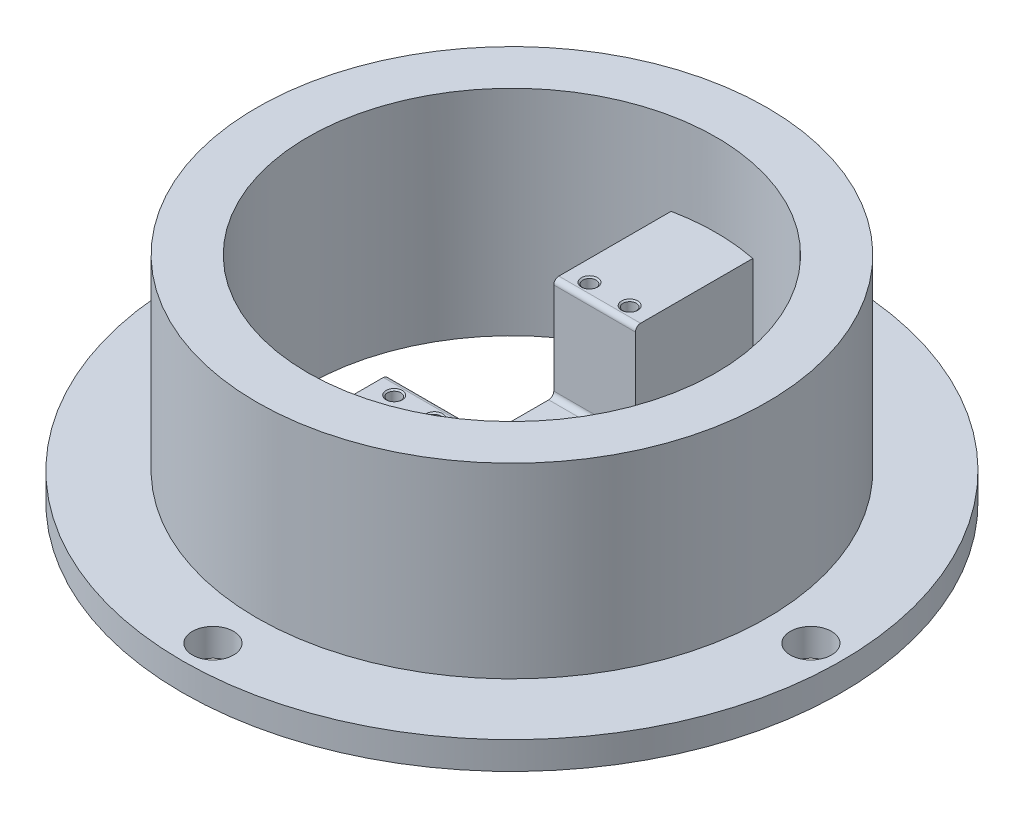
ISO-10303-21;
HEADER;
FILE_DESCRIPTION(('STEP AP214'),'2;1');
FILE_NAME('part.step','',(''),(''),'','','');
FILE_SCHEMA(('AUTOMOTIVE_DESIGN { 1 0 10303 214 1 1 1 1 }'));
ENDSEC;
DATA;
#1=APPLICATION_CONTEXT('core data for automotive mechanical design processes');
#2=APPLICATION_PROTOCOL_DEFINITION('international standard','automotive_design',2000,#1);
#3=PRODUCT_CONTEXT('',#1,'mechanical');
#4=PRODUCT('Part','Part','',(#3));
#5=PRODUCT_RELATED_PRODUCT_CATEGORY('part','',(#4));
#6=PRODUCT_DEFINITION_FORMATION('','',#4);
#7=PRODUCT_DEFINITION_CONTEXT('part definition',#1,'design');
#8=PRODUCT_DEFINITION('design','',#6,#7);
#9=PRODUCT_DEFINITION_SHAPE('','',#8);
#10=(LENGTH_UNIT() NAMED_UNIT(*) SI_UNIT(.MILLI.,.METRE.));
#11=(NAMED_UNIT(*) PLANE_ANGLE_UNIT() SI_UNIT($,.RADIAN.));
#12=(NAMED_UNIT(*) SI_UNIT($,.STERADIAN.) SOLID_ANGLE_UNIT());
#13=UNCERTAINTY_MEASURE_WITH_UNIT(LENGTH_MEASURE(1.E-05),#10,'distance_accuracy_value','');
#14=(GEOMETRIC_REPRESENTATION_CONTEXT(3) GLOBAL_UNCERTAINTY_ASSIGNED_CONTEXT((#13)) GLOBAL_UNIT_ASSIGNED_CONTEXT((#10,
#11,#12)) REPRESENTATION_CONTEXT('',''));
#15=CARTESIAN_POINT('',(0.,0.,0.));
#16=DIRECTION('',(0.,0.,1.));
#17=DIRECTION('',(1.,0.,0.));
#18=AXIS2_PLACEMENT_3D('',#15,#16,#17);
#19=CARTESIAN_POINT('',(10.16,0.,-49.7736315733542));
#20=DIRECTION('',(-1.,0.,0.));
#21=DIRECTION('',(0.,0.,1.));
#22=AXIS2_PLACEMENT_3D('',#19,#20,#21);
#23=PLANE('',#22);
#24=DIRECTION('',(0.,-1.,0.));
#25=VECTOR('',#24,1.);
#26=CARTESIAN_POINT('',(10.16,53.34,20.574));
#27=LINE('',#26,#25);
#28=CARTESIAN_POINT('',(10.16,31.496,20.574));
#29=VERTEX_POINT('',#28);
#30=CARTESIAN_POINT('',(10.16,8.636,20.574));
#31=VERTEX_POINT('',#30);
#32=EDGE_CURVE('E228',#29,#31,#27,.T.);
#33=ORIENTED_EDGE('',*,*,#32,.F.);
#34=CARTESIAN_POINT('',(10.16,31.496,21.844));
#35=DIRECTION('',(-1.,0.,0.));
#36=DIRECTION('',(0.,0.,1.));
#37=AXIS2_PLACEMENT_3D('',#34,#35,#36);
#38=CIRCLE('',#37,1.27);
#39=CARTESIAN_POINT('',(10.16,32.766,21.844));
#40=VERTEX_POINT('',#39);
#41=EDGE_CURVE('E322',#29,#40,#38,.F.);
#42=ORIENTED_EDGE('',*,*,#41,.T.);
#43=DIRECTION('',(0.,0.,-1.));
#44=VECTOR('',#43,1.);
#45=CARTESIAN_POINT('',(10.16,32.766,-11.43));
#46=LINE('',#45,#44);
#47=CARTESIAN_POINT('',(10.16,32.766,49.7736315733542));
#48=VERTEX_POINT('',#47);
#49=EDGE_CURVE('E235',#48,#40,#46,.T.);
#50=ORIENTED_EDGE('',*,*,#49,.F.);
#51=DIRECTION('',(0.,1.,0.));
#52=VECTOR('',#51,1.);
#53=CARTESIAN_POINT('',(10.16,0.,49.7736315733542));
#54=LINE('',#53,#52);
#55=CARTESIAN_POINT('',(10.16,0.,49.7736315733542));
#56=VERTEX_POINT('',#55);
#57=EDGE_CURVE('E243',#56,#48,#54,.T.);
#58=ORIENTED_EDGE('',*,*,#57,.F.);
#59=DIRECTION('',(0.,0.,1.));
#60=VECTOR('',#59,1.);
#61=CARTESIAN_POINT('',(10.16,0.,-49.7736315733542));
#62=LINE('',#61,#60);
#63=CARTESIAN_POINT('',(10.16,0.,-49.7736315733542));
#64=VERTEX_POINT('',#63);
#65=EDGE_CURVE('E262',#64,#56,#62,.T.);
#66=ORIENTED_EDGE('',*,*,#65,.F.);
#67=DIRECTION('',(0.,1.,0.));
#68=VECTOR('',#67,1.);
#69=CARTESIAN_POINT('',(10.16,0.,-49.7736315733542));
#70=LINE('',#69,#68);
#71=CARTESIAN_POINT('',(10.16,32.766,-49.7736315733542));
#72=VERTEX_POINT('',#71);
#73=EDGE_CURVE('E259',#64,#72,#70,.T.);
#74=ORIENTED_EDGE('',*,*,#73,.T.);
#75=CARTESIAN_POINT('',(10.16,32.766,-21.844));
#76=VERTEX_POINT('',#75);
#77=EDGE_CURVE('E239',#76,#72,#46,.T.);
#78=ORIENTED_EDGE('',*,*,#77,.F.);
#79=CARTESIAN_POINT('',(10.16,31.496,-21.844));
#80=DIRECTION('',(-1.,0.,0.));
#81=DIRECTION('',(0.,0.,1.));
#82=AXIS2_PLACEMENT_3D('',#79,#80,#81);
#83=CIRCLE('',#82,1.27);
#84=CARTESIAN_POINT('',(10.16,31.496,-20.574));
#85=VERTEX_POINT('',#84);
#86=EDGE_CURVE('E320',#76,#85,#83,.F.);
#87=ORIENTED_EDGE('',*,*,#86,.T.);
#88=DIRECTION('',(0.,-1.,0.));
#89=VECTOR('',#88,1.);
#90=CARTESIAN_POINT('',(10.16,53.34,-20.574));
#91=LINE('',#90,#89);
#92=CARTESIAN_POINT('',(10.16,8.636,-20.574));
#93=VERTEX_POINT('',#92);
#94=EDGE_CURVE('E225',#85,#93,#91,.T.);
#95=ORIENTED_EDGE('',*,*,#94,.T.);
#96=CARTESIAN_POINT('',(10.16,8.636,-19.304));
#97=DIRECTION('',(-1.,0.,0.));
#98=DIRECTION('',(0.,0.,1.));
#99=AXIS2_PLACEMENT_3D('',#96,#97,#98);
#100=CIRCLE('',#99,1.27);
#101=CARTESIAN_POINT('',(10.16,7.366,-19.304));
#102=VERTEX_POINT('',#101);
#103=EDGE_CURVE('E12',#93,#102,#100,.T.);
#104=ORIENTED_EDGE('',*,*,#103,.T.);
#105=DIRECTION('',(0.,0.,-1.));
#106=VECTOR('',#105,1.);
#107=CARTESIAN_POINT('',(10.16,7.366,20.574));
#108=LINE('',#107,#106);
#109=CARTESIAN_POINT('',(10.16,7.366,19.304));
#110=VERTEX_POINT('',#109);
#111=EDGE_CURVE('E220',#110,#102,#108,.T.);
#112=ORIENTED_EDGE('',*,*,#111,.F.);
#113=CARTESIAN_POINT('',(10.16,8.636,19.304));
#114=DIRECTION('',(-1.,0.,0.));
#115=DIRECTION('',(0.,0.,1.));
#116=AXIS2_PLACEMENT_3D('',#113,#114,#115);
#117=CIRCLE('',#116,1.27);
#118=EDGE_CURVE('E336',#110,#31,#117,.T.);
#119=ORIENTED_EDGE('',*,*,#118,.T.);
#120=EDGE_LOOP('',(#33,#42,#50,#58,#66,#74,#78,#87,#95,#104,#112,#119));
#121=FACE_BOUND('',#120,.T.);
#122=ADVANCED_FACE('F77',(#121),#23,.F.);
#123=CARTESIAN_POINT('',(-10.16,0.,-49.7736315733542));
#124=DIRECTION('',(1.,0.,0.));
#125=DIRECTION('',(0.,0.,-1.));
#126=AXIS2_PLACEMENT_3D('',#123,#124,#125);
#127=PLANE('',#126);
#128=DIRECTION('',(0.,0.,-1.));
#129=VECTOR('',#128,1.);
#130=CARTESIAN_POINT('',(-10.16,32.766,-11.43));
#131=LINE('',#130,#129);
#132=CARTESIAN_POINT('',(-10.16,32.766,49.7736315733542));
#133=VERTEX_POINT('',#132);
#134=CARTESIAN_POINT('',(-10.16,32.766,21.844));
#135=VERTEX_POINT('',#134);
#136=EDGE_CURVE('E240',#133,#135,#131,.T.);
#137=ORIENTED_EDGE('',*,*,#136,.T.);
#138=CARTESIAN_POINT('',(-10.16,31.496,21.844));
#139=DIRECTION('',(1.,0.,0.));
#140=DIRECTION('',(0.,0.,-1.));
#141=AXIS2_PLACEMENT_3D('',#138,#139,#140);
#142=CIRCLE('',#141,1.27);
#143=CARTESIAN_POINT('',(-10.16,31.496,20.574));
#144=VERTEX_POINT('',#143);
#145=EDGE_CURVE('E327',#135,#144,#142,.F.);
#146=ORIENTED_EDGE('',*,*,#145,.T.);
#147=DIRECTION('',(0.,-1.,0.));
#148=VECTOR('',#147,1.);
#149=CARTESIAN_POINT('',(-10.16,53.34,20.574));
#150=LINE('',#149,#148);
#151=CARTESIAN_POINT('',(-10.16,8.636,20.574));
#152=VERTEX_POINT('',#151);
#153=EDGE_CURVE('E231',#144,#152,#150,.T.);
#154=ORIENTED_EDGE('',*,*,#153,.T.);
#155=CARTESIAN_POINT('',(-10.16,8.636,19.304));
#156=DIRECTION('',(1.,0.,0.));
#157=DIRECTION('',(0.,0.,-1.));
#158=AXIS2_PLACEMENT_3D('',#155,#156,#157);
#159=CIRCLE('',#158,1.27);
#160=CARTESIAN_POINT('',(-10.16,7.366,19.304));
#161=VERTEX_POINT('',#160);
#162=EDGE_CURVE('E338',#152,#161,#159,.T.);
#163=ORIENTED_EDGE('',*,*,#162,.T.);
#164=DIRECTION('',(0.,0.,1.));
#165=VECTOR('',#164,1.);
#166=CARTESIAN_POINT('',(-10.16,7.366,20.574));
#167=LINE('',#166,#165);
#168=CARTESIAN_POINT('',(-10.16,7.366,-19.304));
#169=VERTEX_POINT('',#168);
#170=EDGE_CURVE('E217',#169,#161,#167,.T.);
#171=ORIENTED_EDGE('',*,*,#170,.F.);
#172=CARTESIAN_POINT('',(-10.16,8.636,-19.304));
#173=DIRECTION('',(1.,0.,0.));
#174=DIRECTION('',(0.,0.,-1.));
#175=AXIS2_PLACEMENT_3D('',#172,#173,#174);
#176=CIRCLE('',#175,1.27);
#177=CARTESIAN_POINT('',(-10.16,8.636,-20.574));
#178=VERTEX_POINT('',#177);
#179=EDGE_CURVE('E85',#169,#178,#176,.T.);
#180=ORIENTED_EDGE('',*,*,#179,.T.);
#181=DIRECTION('',(0.,-1.,0.));
#182=VECTOR('',#181,1.);
#183=CARTESIAN_POINT('',(-10.16,53.34,-20.574));
#184=LINE('',#183,#182);
#185=CARTESIAN_POINT('',(-10.16,31.496,-20.574));
#186=VERTEX_POINT('',#185);
#187=EDGE_CURVE('E223',#186,#178,#184,.T.);
#188=ORIENTED_EDGE('',*,*,#187,.F.);
#189=CARTESIAN_POINT('',(-10.16,31.496,-21.844));
#190=DIRECTION('',(1.,0.,0.));
#191=DIRECTION('',(0.,0.,-1.));
#192=AXIS2_PLACEMENT_3D('',#189,#190,#191);
#193=CIRCLE('',#192,1.27);
#194=CARTESIAN_POINT('',(-10.16,32.766,-21.844));
#195=VERTEX_POINT('',#194);
#196=EDGE_CURVE('E92',#186,#195,#193,.F.);
#197=ORIENTED_EDGE('',*,*,#196,.T.);
#198=CARTESIAN_POINT('',(-10.16,32.766,-49.7736315733542));
#199=VERTEX_POINT('',#198);
#200=EDGE_CURVE('E238',#195,#199,#131,.T.);
#201=ORIENTED_EDGE('',*,*,#200,.T.);
#202=DIRECTION('',(0.,1.,0.));
#203=VECTOR('',#202,1.);
#204=CARTESIAN_POINT('',(-10.16,0.,-49.7736315733542));
#205=LINE('',#204,#203);
#206=CARTESIAN_POINT('',(-10.16,0.,-49.7736315733542));
#207=VERTEX_POINT('',#206);
#208=EDGE_CURVE('E254',#207,#199,#205,.T.);
#209=ORIENTED_EDGE('',*,*,#208,.F.);
#210=DIRECTION('',(0.,0.,-1.));
#211=VECTOR('',#210,1.);
#212=CARTESIAN_POINT('',(-10.16,0.,-49.7736315733542));
#213=LINE('',#212,#211);
#214=CARTESIAN_POINT('',(-10.16,0.,49.7736315733542));
#215=VERTEX_POINT('',#214);
#216=EDGE_CURVE('E249',#215,#207,#213,.T.);
#217=ORIENTED_EDGE('',*,*,#216,.F.);
#218=DIRECTION('',(0.,1.,0.));
#219=VECTOR('',#218,1.);
#220=CARTESIAN_POINT('',(-10.16,0.,49.7736315733542));
#221=LINE('',#220,#219);
#222=EDGE_CURVE('E253',#215,#133,#221,.T.);
#223=ORIENTED_EDGE('',*,*,#222,.T.);
#224=EDGE_LOOP('',(#137,#146,#154,#163,#171,#180,#188,#197,#201,#209,#217,#223));
#225=FACE_BOUND('',#224,.T.);
#226=ADVANCED_FACE('F340',(#225),#127,.F.);
#227=CARTESIAN_POINT('',(0.,32.766,0.));
#228=DIRECTION('',(0.,-1.,0.));
#229=DIRECTION('',(0.,0.,-1.));
#230=AXIS2_PLACEMENT_3D('',#227,#228,#229);
#231=PLANE('',#230);
#232=CARTESIAN_POINT('',(-5.00000000000001,32.766,24.3));
#233=DIRECTION('',(0.,1.,0.));
#234=DIRECTION('',(0.,0.,1.));
#235=AXIS2_PLACEMENT_3D('',#232,#233,#234);
#236=CIRCLE('',#235,2.025);
#237=CARTESIAN_POINT('',(-5.00000000000001,32.766,26.325));
#238=VERTEX_POINT('',#237);
#239=EDGE_CURVE('E199',#238,#238,#236,.T.);
#240=ORIENTED_EDGE('',*,*,#239,.F.);
#241=EDGE_LOOP('',(#240));
#242=FACE_BOUND('',#241,.T.);
#243=CARTESIAN_POINT('',(4.99999999999999,32.766,24.3));
#244=DIRECTION('',(0.,1.,0.));
#245=DIRECTION('',(0.,0.,1.));
#246=AXIS2_PLACEMENT_3D('',#243,#244,#245);
#247=CIRCLE('',#246,2.025);
#248=CARTESIAN_POINT('',(4.99999999999999,32.766,26.325));
#249=VERTEX_POINT('',#248);
#250=EDGE_CURVE('E208',#249,#249,#247,.T.);
#251=ORIENTED_EDGE('',*,*,#250,.F.);
#252=EDGE_LOOP('',(#251));
#253=FACE_BOUND('',#252,.T.);
#254=ORIENTED_EDGE('',*,*,#49,.T.);
#255=DIRECTION('',(1.,0.,0.));
#256=VECTOR('',#255,1.);
#257=CARTESIAN_POINT('',(-10.16,32.766,21.844));
#258=LINE('',#257,#256);
#259=EDGE_CURVE('E324',#40,#135,#258,.F.);
#260=ORIENTED_EDGE('',*,*,#259,.T.);
#261=ORIENTED_EDGE('',*,*,#136,.F.);
#262=CARTESIAN_POINT('',(0.,32.766,0.));
#263=DIRECTION('',(0.,1.,0.));
#264=DIRECTION('',(0.,0.,1.));
#265=AXIS2_PLACEMENT_3D('',#262,#263,#264);
#266=CIRCLE('',#265,50.8);
#267=EDGE_CURVE('E234',#133,#48,#266,.T.);
#268=ORIENTED_EDGE('',*,*,#267,.T.);
#269=EDGE_LOOP('',(#254,#260,#261,#268));
#270=FACE_BOUND('',#269,.T.);
#271=ADVANCED_FACE('F362',(#242,#253,#270),#231,.F.);
#272=CARTESIAN_POINT('',(4.99999999999999,32.766,-24.3));
#273=DIRECTION('',(0.,1.,0.));
#274=DIRECTION('',(0.,0.,1.));
#275=AXIS2_PLACEMENT_3D('',#272,#273,#274);
#276=CIRCLE('',#275,2.025);
#277=CARTESIAN_POINT('',(4.99999999999999,32.766,-22.275));
#278=VERTEX_POINT('',#277);
#279=EDGE_CURVE('E190',#278,#278,#276,.T.);
#280=ORIENTED_EDGE('',*,*,#279,.F.);
#281=EDGE_LOOP('',(#280));
#282=FACE_BOUND('',#281,.T.);
#283=CARTESIAN_POINT('',(-5.00000000000001,32.766,-24.3));
#284=DIRECTION('',(0.,1.,0.));
#285=DIRECTION('',(0.,0.,1.));
#286=AXIS2_PLACEMENT_3D('',#283,#284,#285);
#287=CIRCLE('',#286,2.025);
#288=CARTESIAN_POINT('',(-5.00000000000001,32.766,-22.275));
#289=VERTEX_POINT('',#288);
#290=EDGE_CURVE('E183',#289,#289,#287,.T.);
#291=ORIENTED_EDGE('',*,*,#290,.F.);
#292=EDGE_LOOP('',(#291));
#293=FACE_BOUND('',#292,.T.);
#294=ORIENTED_EDGE('',*,*,#200,.F.);
#295=DIRECTION('',(-1.,0.,0.));
#296=VECTOR('',#295,1.);
#297=CARTESIAN_POINT('',(10.16,32.766,-21.844));
#298=LINE('',#297,#296);
#299=EDGE_CURVE('E334',#195,#76,#298,.F.);
#300=ORIENTED_EDGE('',*,*,#299,.T.);
#301=ORIENTED_EDGE('',*,*,#77,.T.);
#302=CARTESIAN_POINT('',(0.,32.766,0.));
#303=DIRECTION('',(0.,-1.,0.));
#304=DIRECTION('',(0.,0.,-1.));
#305=AXIS2_PLACEMENT_3D('',#302,#303,#304);
#306=CIRCLE('',#305,50.8);
#307=EDGE_CURVE('E306',#199,#72,#306,.T.);
#308=ORIENTED_EDGE('',*,*,#307,.F.);
#309=EDGE_LOOP('',(#294,#300,#301,#308));
#310=FACE_BOUND('',#309,.T.);
#311=ADVANCED_FACE('F442',(#282,#293,#310),#231,.F.);
#312=CARTESIAN_POINT('',(0.,53.34,0.));
#313=DIRECTION('',(0.,-1.,0.));
#314=DIRECTION('',(0.,0.,-1.));
#315=AXIS2_PLACEMENT_3D('',#312,#313,#314);
#316=CYLINDRICAL_SURFACE('',#315,50.8);
#317=CARTESIAN_POINT('',(0.,53.34,0.));
#318=DIRECTION('',(0.,1.,0.));
#319=DIRECTION('',(0.,0.,1.));
#320=AXIS2_PLACEMENT_3D('',#317,#318,#319);
#321=CIRCLE('',#320,50.8);
#322=CARTESIAN_POINT('',(0.,53.34,50.8));
#323=VERTEX_POINT('',#322);
#324=EDGE_CURVE('E300',#323,#323,#321,.T.);
#325=ORIENTED_EDGE('',*,*,#324,.T.);
#326=EDGE_LOOP('',(#325));
#327=FACE_BOUND('',#326,.T.);
#328=ORIENTED_EDGE('',*,*,#57,.T.);
#329=ORIENTED_EDGE('',*,*,#267,.F.);
#330=ORIENTED_EDGE('',*,*,#222,.F.);
#331=CARTESIAN_POINT('',(0.,0.,0.));
#332=DIRECTION('',(0.,1.,0.));
#333=DIRECTION('',(0.,0.,1.));
#334=AXIS2_PLACEMENT_3D('',#331,#332,#333);
#335=CIRCLE('',#334,50.8);
#336=EDGE_CURVE('E246',#207,#215,#335,.T.);
#337=ORIENTED_EDGE('',*,*,#336,.F.);
#338=ORIENTED_EDGE('',*,*,#208,.T.);
#339=ORIENTED_EDGE('',*,*,#307,.T.);
#340=ORIENTED_EDGE('',*,*,#73,.F.);
#341=CARTESIAN_POINT('',(0.,0.,0.));
#342=DIRECTION('',(0.,1.,0.));
#343=DIRECTION('',(0.,0.,1.));
#344=AXIS2_PLACEMENT_3D('',#341,#342,#343);
#345=CIRCLE('',#344,50.8);
#346=EDGE_CURVE('E250',#56,#64,#345,.T.);
#347=ORIENTED_EDGE('',*,*,#346,.F.);
#348=EDGE_LOOP('',(#328,#329,#330,#337,#338,#339,#340,#347));
#349=FACE_BOUND('',#348,.T.);
#350=ADVANCED_FACE('F366',(#327,#349),#316,.F.);
#351=CARTESIAN_POINT('',(0.,53.34,0.));
#352=DIRECTION('',(0.,1.,0.));
#353=DIRECTION('',(0.,0.,1.));
#354=AXIS2_PLACEMENT_3D('',#351,#352,#353);
#355=PLANE('',#354);
#356=CARTESIAN_POINT('',(0.,53.34,0.));
#357=DIRECTION('',(0.,1.,0.));
#358=DIRECTION('',(0.,0.,1.));
#359=AXIS2_PLACEMENT_3D('',#356,#357,#358);
#360=CIRCLE('',#359,63.5);
#361=CARTESIAN_POINT('',(0.,53.34,63.5));
#362=VERTEX_POINT('',#361);
#363=EDGE_CURVE('E303',#362,#362,#360,.T.);
#364=ORIENTED_EDGE('',*,*,#363,.T.);
#365=EDGE_LOOP('',(#364));
#366=FACE_BOUND('',#365,.T.);
#367=ORIENTED_EDGE('',*,*,#324,.F.);
#368=EDGE_LOOP('',(#367));
#369=FACE_BOUND('',#368,.T.);
#370=ADVANCED_FACE('F398',(#366,#369),#355,.T.);
#371=CARTESIAN_POINT('',(0.,53.34,0.));
#372=DIRECTION('',(0.,-1.,0.));
#373=DIRECTION('',(0.,0.,-1.));
#374=AXIS2_PLACEMENT_3D('',#371,#372,#373);
#375=CYLINDRICAL_SURFACE('',#374,63.5);
#376=CARTESIAN_POINT('',(0.,6.858,0.));
#377=DIRECTION('',(0.,1.,0.));
#378=DIRECTION('',(0.,0.,1.));
#379=AXIS2_PLACEMENT_3D('',#376,#377,#378);
#380=CIRCLE('',#379,63.5);
#381=CARTESIAN_POINT('',(0.,6.858,63.5));
#382=VERTEX_POINT('',#381);
#383=EDGE_CURVE('E295',#382,#382,#380,.T.);
#384=ORIENTED_EDGE('',*,*,#383,.T.);
#385=EDGE_LOOP('',(#384));
#386=FACE_BOUND('',#385,.T.);
#387=ORIENTED_EDGE('',*,*,#363,.F.);
#388=EDGE_LOOP('',(#387));
#389=FACE_BOUND('',#388,.T.);
#390=ADVANCED_FACE('F389',(#386,#389),#375,.T.);
#391=CARTESIAN_POINT('',(0.,6.858,0.));
#392=DIRECTION('',(0.,-1.,0.));
#393=DIRECTION('',(0.,0.,-1.));
#394=AXIS2_PLACEMENT_3D('',#391,#392,#393);
#395=CYLINDRICAL_SURFACE('',#394,82.0154236605615);
#396=CARTESIAN_POINT('',(0.,6.858,0.));
#397=DIRECTION('',(0.,1.,0.));
#398=DIRECTION('',(0.,0.,1.));
#399=AXIS2_PLACEMENT_3D('',#396,#397,#398);
#400=CIRCLE('',#399,82.0154236605615);
#401=CARTESIAN_POINT('',(0.,6.858,82.0154236605615));
#402=VERTEX_POINT('',#401);
#403=EDGE_CURVE('E292',#402,#402,#400,.T.);
#404=ORIENTED_EDGE('',*,*,#403,.F.);
#405=EDGE_LOOP('',(#404));
#406=FACE_BOUND('',#405,.T.);
#407=CARTESIAN_POINT('',(0.,0.,0.));
#408=DIRECTION('',(0.,1.,0.));
#409=DIRECTION('',(0.,0.,1.));
#410=AXIS2_PLACEMENT_3D('',#407,#408,#409);
#411=CIRCLE('',#410,82.0154236605615);
#412=CARTESIAN_POINT('',(0.,0.,82.0154236605615));
#413=VERTEX_POINT('',#412);
#414=EDGE_CURVE('E291',#413,#413,#411,.T.);
#415=ORIENTED_EDGE('',*,*,#414,.T.);
#416=EDGE_LOOP('',(#415));
#417=FACE_BOUND('',#416,.T.);
#418=ADVANCED_FACE('F387',(#406,#417),#395,.T.);
#419=CARTESIAN_POINT('',(0.,6.858,0.));
#420=DIRECTION('',(0.,1.,0.));
#421=DIRECTION('',(0.,0.,1.));
#422=AXIS2_PLACEMENT_3D('',#419,#420,#421);
#423=PLANE('',#422);
#424=CARTESIAN_POINT('',(0.,6.858,-74.3954236605615));
#425=DIRECTION('',(0.,1.,0.));
#426=DIRECTION('',(0.,0.,1.));
#427=AXIS2_PLACEMENT_3D('',#424,#425,#426);
#428=CIRCLE('',#427,5.1214563423742);
#429=CARTESIAN_POINT('',(0.,6.858,-69.2739673181873));
#430=VERTEX_POINT('',#429);
#431=EDGE_CURVE('E288',#430,#430,#428,.T.);
#432=ORIENTED_EDGE('',*,*,#431,.F.);
#433=EDGE_LOOP('',(#432));
#434=FACE_BOUND('',#433,.T.);
#435=CARTESIAN_POINT('',(-74.6494236605615,6.858,0.));
#436=DIRECTION('',(0.,1.,0.));
#437=DIRECTION('',(0.,0.,1.));
#438=AXIS2_PLACEMENT_3D('',#435,#436,#437);
#439=CIRCLE('',#438,5.1214563423742);
#440=CARTESIAN_POINT('',(-74.6494236605615,6.858,5.1214563423742));
#441=VERTEX_POINT('',#440);
#442=EDGE_CURVE('E285',#441,#441,#439,.T.);
#443=ORIENTED_EDGE('',*,*,#442,.F.);
#444=EDGE_LOOP('',(#443));
#445=FACE_BOUND('',#444,.T.);
#446=CARTESIAN_POINT('',(74.3954236605615,6.858,0.));
#447=DIRECTION('',(0.,1.,0.));
#448=DIRECTION('',(0.,0.,1.));
#449=AXIS2_PLACEMENT_3D('',#446,#447,#448);
#450=CIRCLE('',#449,5.1214563423742);
#451=CARTESIAN_POINT('',(74.3954236605615,6.858,5.1214563423742));
#452=VERTEX_POINT('',#451);
#453=EDGE_CURVE('E282',#452,#452,#450,.T.);
#454=ORIENTED_EDGE('',*,*,#453,.F.);
#455=EDGE_LOOP('',(#454));
#456=FACE_BOUND('',#455,.T.);
#457=CARTESIAN_POINT('',(0.,6.858,74.3954236605615));
#458=DIRECTION('',(0.,1.,0.));
#459=DIRECTION('',(0.,0.,1.));
#460=AXIS2_PLACEMENT_3D('',#457,#458,#459);
#461=CIRCLE('',#460,5.1214563423742);
#462=CARTESIAN_POINT('',(0.,6.858,79.5168800029357));
#463=VERTEX_POINT('',#462);
#464=EDGE_CURVE('E271',#463,#463,#461,.T.);
#465=ORIENTED_EDGE('',*,*,#464,.F.);
#466=EDGE_LOOP('',(#465));
#467=FACE_BOUND('',#466,.T.);
#468=ORIENTED_EDGE('',*,*,#383,.F.);
#469=EDGE_LOOP('',(#468));
#470=FACE_BOUND('',#469,.T.);
#471=ORIENTED_EDGE('',*,*,#403,.T.);
#472=EDGE_LOOP('',(#471));
#473=FACE_BOUND('',#472,.T.);
#474=ADVANCED_FACE('F374',(#434,#445,#456,#467,#470,#473),#423,.T.);
#475=CARTESIAN_POINT('',(0.,0.,0.));
#476=DIRECTION('',(0.,1.,0.));
#477=DIRECTION('',(0.,0.,1.));
#478=AXIS2_PLACEMENT_3D('',#475,#476,#477);
#479=PLANE('',#478);
#480=ORIENTED_EDGE('',*,*,#216,.T.);
#481=ORIENTED_EDGE('',*,*,#336,.T.);
#482=EDGE_LOOP('',(#480,#481));
#483=FACE_BOUND('',#482,.T.);
#484=ORIENTED_EDGE('',*,*,#65,.T.);
#485=ORIENTED_EDGE('',*,*,#346,.T.);
#486=EDGE_LOOP('',(#484,#485));
#487=FACE_BOUND('',#486,.T.);
#488=CARTESIAN_POINT('',(0.,0.,-74.3954236605615));
#489=DIRECTION('',(0.,1.,0.));
#490=DIRECTION('',(0.,0.,1.));
#491=AXIS2_PLACEMENT_3D('',#488,#489,#490);
#492=CIRCLE('',#491,5.1214563423742);
#493=CARTESIAN_POINT('',(0.,0.,-69.2739673181873));
#494=VERTEX_POINT('',#493);
#495=EDGE_CURVE('E268',#494,#494,#492,.T.);
#496=ORIENTED_EDGE('',*,*,#495,.T.);
#497=EDGE_LOOP('',(#496));
#498=FACE_BOUND('',#497,.T.);
#499=CARTESIAN_POINT('',(-74.6494236605615,0.,0.));
#500=DIRECTION('',(0.,1.,0.));
#501=DIRECTION('',(0.,0.,1.));
#502=AXIS2_PLACEMENT_3D('',#499,#500,#501);
#503=CIRCLE('',#502,5.1214563423742);
#504=CARTESIAN_POINT('',(-74.6494236605615,0.,5.1214563423742));
#505=VERTEX_POINT('',#504);
#506=EDGE_CURVE('E272',#505,#505,#503,.T.);
#507=ORIENTED_EDGE('',*,*,#506,.T.);
#508=EDGE_LOOP('',(#507));
#509=FACE_BOUND('',#508,.T.);
#510=CARTESIAN_POINT('',(74.3954236605615,0.,0.));
#511=DIRECTION('',(0.,1.,0.));
#512=DIRECTION('',(0.,0.,1.));
#513=AXIS2_PLACEMENT_3D('',#510,#511,#512);
#514=CIRCLE('',#513,5.1214563423742);
#515=CARTESIAN_POINT('',(74.3954236605615,0.,5.1214563423742));
#516=VERTEX_POINT('',#515);
#517=EDGE_CURVE('E275',#516,#516,#514,.T.);
#518=ORIENTED_EDGE('',*,*,#517,.T.);
#519=EDGE_LOOP('',(#518));
#520=FACE_BOUND('',#519,.T.);
#521=CARTESIAN_POINT('',(0.,0.,74.3954236605615));
#522=DIRECTION('',(0.,1.,0.));
#523=DIRECTION('',(0.,0.,1.));
#524=AXIS2_PLACEMENT_3D('',#521,#522,#523);
#525=CIRCLE('',#524,5.1214563423742);
#526=CARTESIAN_POINT('',(0.,0.,79.5168800029357));
#527=VERTEX_POINT('',#526);
#528=EDGE_CURVE('E257',#527,#527,#525,.T.);
#529=ORIENTED_EDGE('',*,*,#528,.T.);
#530=EDGE_LOOP('',(#529));
#531=FACE_BOUND('',#530,.T.);
#532=ORIENTED_EDGE('',*,*,#414,.F.);
#533=EDGE_LOOP('',(#532));
#534=FACE_BOUND('',#533,.T.);
#535=ADVANCED_FACE('F370',(#483,#487,#498,#509,#520,#531,#534),#479,.F.);
#536=CARTESIAN_POINT('',(0.,0.,74.3954236605615));
#537=DIRECTION('',(0.,1.,0.));
#538=DIRECTION('',(0.,0.,1.));
#539=AXIS2_PLACEMENT_3D('',#536,#537,#538);
#540=CYLINDRICAL_SURFACE('',#539,5.1214563423742);
#541=ORIENTED_EDGE('',*,*,#464,.T.);
#542=EDGE_LOOP('',(#541));
#543=FACE_BOUND('',#542,.T.);
#544=ORIENTED_EDGE('',*,*,#528,.F.);
#545=EDGE_LOOP('',(#544));
#546=FACE_BOUND('',#545,.T.);
#547=ADVANCED_FACE('F373',(#543,#546),#540,.F.);
#548=CARTESIAN_POINT('',(74.3954236605615,0.,0.));
#549=DIRECTION('',(0.,1.,0.));
#550=DIRECTION('',(0.,0.,1.));
#551=AXIS2_PLACEMENT_3D('',#548,#549,#550);
#552=CYLINDRICAL_SURFACE('',#551,5.1214563423742);
#553=ORIENTED_EDGE('',*,*,#453,.T.);
#554=EDGE_LOOP('',(#553));
#555=FACE_BOUND('',#554,.T.);
#556=ORIENTED_EDGE('',*,*,#517,.F.);
#557=EDGE_LOOP('',(#556));
#558=FACE_BOUND('',#557,.T.);
#559=ADVANCED_FACE('F419',(#555,#558),#552,.F.);
#560=CARTESIAN_POINT('',(-74.6494236605615,0.,0.));
#561=DIRECTION('',(0.,1.,0.));
#562=DIRECTION('',(0.,0.,1.));
#563=AXIS2_PLACEMENT_3D('',#560,#561,#562);
#564=CYLINDRICAL_SURFACE('',#563,5.1214563423742);
#565=ORIENTED_EDGE('',*,*,#442,.T.);
#566=EDGE_LOOP('',(#565));
#567=FACE_BOUND('',#566,.T.);
#568=ORIENTED_EDGE('',*,*,#506,.F.);
#569=EDGE_LOOP('',(#568));
#570=FACE_BOUND('',#569,.T.);
#571=ADVANCED_FACE('F415',(#567,#570),#564,.F.);
#572=CARTESIAN_POINT('',(0.,0.,-74.3954236605615));
#573=DIRECTION('',(0.,1.,0.));
#574=DIRECTION('',(0.,0.,1.));
#575=AXIS2_PLACEMENT_3D('',#572,#573,#574);
#576=CYLINDRICAL_SURFACE('',#575,5.1214563423742);
#577=ORIENTED_EDGE('',*,*,#431,.T.);
#578=EDGE_LOOP('',(#577));
#579=FACE_BOUND('',#578,.T.);
#580=ORIENTED_EDGE('',*,*,#495,.F.);
#581=EDGE_LOOP('',(#580));
#582=FACE_BOUND('',#581,.T.);
#583=ADVANCED_FACE('F412',(#579,#582),#576,.F.);
#584=CARTESIAN_POINT('',(-10.16,53.34,20.574));
#585=DIRECTION('',(0.,0.,-1.));
#586=DIRECTION('',(-1.,0.,0.));
#587=AXIS2_PLACEMENT_3D('',#584,#585,#586);
#588=PLANE('',#587);
#589=ORIENTED_EDGE('',*,*,#32,.T.);
#590=DIRECTION('',(1.,0.,0.));
#591=VECTOR('',#590,1.);
#592=CARTESIAN_POINT('',(-10.16,8.636,20.574));
#593=LINE('',#592,#591);
#594=EDGE_CURVE('E318',#31,#152,#593,.F.);
#595=ORIENTED_EDGE('',*,*,#594,.T.);
#596=ORIENTED_EDGE('',*,*,#153,.F.);
#597=DIRECTION('',(1.,0.,0.));
#598=VECTOR('',#597,1.);
#599=CARTESIAN_POINT('',(10.16,31.496,20.574));
#600=LINE('',#599,#598);
#601=EDGE_CURVE('E315',#144,#29,#600,.T.);
#602=ORIENTED_EDGE('',*,*,#601,.T.);
#603=EDGE_LOOP('',(#589,#595,#596,#602));
#604=FACE_BOUND('',#603,.T.);
#605=ADVANCED_FACE('F353',(#604),#588,.T.);
#606=CARTESIAN_POINT('',(-10.16,53.34,-20.574));
#607=DIRECTION('',(0.,0.,1.));
#608=DIRECTION('',(1.,0.,0.));
#609=AXIS2_PLACEMENT_3D('',#606,#607,#608);
#610=PLANE('',#609);
#611=ORIENTED_EDGE('',*,*,#94,.F.);
#612=DIRECTION('',(-1.,0.,0.));
#613=VECTOR('',#612,1.);
#614=CARTESIAN_POINT('',(-10.16,31.496,-20.574));
#615=LINE('',#614,#613);
#616=EDGE_CURVE('E331',#85,#186,#615,.T.);
#617=ORIENTED_EDGE('',*,*,#616,.T.);
#618=ORIENTED_EDGE('',*,*,#187,.T.);
#619=DIRECTION('',(-1.,0.,0.));
#620=VECTOR('',#619,1.);
#621=CARTESIAN_POINT('',(-10.16,8.636,-20.574));
#622=LINE('',#621,#620);
#623=EDGE_CURVE('E329',#178,#93,#622,.F.);
#624=ORIENTED_EDGE('',*,*,#623,.T.);
#625=EDGE_LOOP('',(#611,#617,#618,#624));
#626=FACE_BOUND('',#625,.T.);
#627=ADVANCED_FACE('F466',(#626),#610,.T.);
#628=CARTESIAN_POINT('',(0.,7.366,0.));
#629=DIRECTION('',(0.,-1.,0.));
#630=DIRECTION('',(0.,0.,-1.));
#631=AXIS2_PLACEMENT_3D('',#628,#629,#630);
#632=PLANE('',#631);
#633=ORIENTED_EDGE('',*,*,#170,.T.);
#634=DIRECTION('',(1.,0.,0.));
#635=VECTOR('',#634,1.);
#636=CARTESIAN_POINT('',(0.,7.366,19.304));
#637=LINE('',#636,#635);
#638=EDGE_CURVE('E312',#161,#110,#637,.T.);
#639=ORIENTED_EDGE('',*,*,#638,.T.);
#640=ORIENTED_EDGE('',*,*,#111,.T.);
#641=DIRECTION('',(-1.,0.,0.));
#642=VECTOR('',#641,1.);
#643=CARTESIAN_POINT('',(0.,7.366,-19.304));
#644=LINE('',#643,#642);
#645=EDGE_CURVE('E309',#102,#169,#644,.T.);
#646=ORIENTED_EDGE('',*,*,#645,.T.);
#647=EDGE_LOOP('',(#633,#639,#640,#646));
#648=FACE_BOUND('',#647,.T.);
#649=ADVANCED_FACE('F346',(#648),#632,.F.);
#650=CARTESIAN_POINT('',(0.,8.636,19.304));
#651=DIRECTION('',(1.,0.,0.));
#652=DIRECTION('',(0.,0.,-1.));
#653=AXIS2_PLACEMENT_3D('',#650,#651,#652);
#654=CYLINDRICAL_SURFACE('',#653,1.27);
#655=ORIENTED_EDGE('',*,*,#162,.F.);
#656=ORIENTED_EDGE('',*,*,#594,.F.);
#657=ORIENTED_EDGE('',*,*,#118,.F.);
#658=ORIENTED_EDGE('',*,*,#638,.F.);
#659=EDGE_LOOP('',(#655,#656,#657,#658));
#660=FACE_BOUND('',#659,.T.);
#661=ADVANCED_FACE('F349',(#660),#654,.F.);
#662=CARTESIAN_POINT('',(-10.16,31.496,21.844));
#663=DIRECTION('',(-1.,0.,0.));
#664=DIRECTION('',(0.,0.,1.));
#665=AXIS2_PLACEMENT_3D('',#662,#663,#664);
#666=CYLINDRICAL_SURFACE('',#665,1.27);
#667=ORIENTED_EDGE('',*,*,#145,.F.);
#668=ORIENTED_EDGE('',*,*,#259,.F.);
#669=ORIENTED_EDGE('',*,*,#41,.F.);
#670=ORIENTED_EDGE('',*,*,#601,.F.);
#671=EDGE_LOOP('',(#667,#668,#669,#670));
#672=FACE_BOUND('',#671,.T.);
#673=ADVANCED_FACE('F357',(#672),#666,.T.);
#674=CARTESIAN_POINT('',(-10.16,31.496,-21.844));
#675=DIRECTION('',(1.,0.,0.));
#676=DIRECTION('',(0.,0.,-1.));
#677=AXIS2_PLACEMENT_3D('',#674,#675,#676);
#678=CYLINDRICAL_SURFACE('',#677,1.27);
#679=ORIENTED_EDGE('',*,*,#86,.F.);
#680=ORIENTED_EDGE('',*,*,#299,.F.);
#681=ORIENTED_EDGE('',*,*,#196,.F.);
#682=ORIENTED_EDGE('',*,*,#616,.F.);
#683=EDGE_LOOP('',(#679,#680,#681,#682));
#684=FACE_BOUND('',#683,.T.);
#685=ADVANCED_FACE('F451',(#684),#678,.T.);
#686=CARTESIAN_POINT('',(0.,8.636,-19.304));
#687=DIRECTION('',(-1.,0.,0.));
#688=DIRECTION('',(0.,0.,1.));
#689=AXIS2_PLACEMENT_3D('',#686,#687,#688);
#690=CYLINDRICAL_SURFACE('',#689,1.27);
#691=ORIENTED_EDGE('',*,*,#103,.F.);
#692=ORIENTED_EDGE('',*,*,#623,.F.);
#693=ORIENTED_EDGE('',*,*,#179,.F.);
#694=ORIENTED_EDGE('',*,*,#645,.F.);
#695=EDGE_LOOP('',(#691,#692,#693,#694));
#696=FACE_BOUND('',#695,.T.);
#697=ADVANCED_FACE('F79',(#696),#690,.F.);
#698=CARTESIAN_POINT('',(4.99999999999999,22.86,24.3));
#699=DIRECTION('',(0.,1.,0.));
#700=DIRECTION('',(0.,0.,1.));
#701=AXIS2_PLACEMENT_3D('',#698,#699,#700);
#702=CONICAL_SURFACE('',#701,1.64999999999999,1.02974425867665);
#703=CARTESIAN_POINT('',(4.99999999999999,21.8685799786045,24.3));
#704=VERTEX_POINT('',#703);
#705=VERTEX_LOOP('',#704);
#706=FACE_BOUND('',#705,.T.);
#707=CARTESIAN_POINT('',(4.99999999999999,22.86,24.3));
#708=DIRECTION('',(0.,1.,0.));
#709=DIRECTION('',(0.,0.,1.));
#710=AXIS2_PLACEMENT_3D('',#707,#708,#709);
#711=CIRCLE('',#710,1.64999999999999);
#712=CARTESIAN_POINT('',(4.99999999999999,22.86,25.95));
#713=VERTEX_POINT('',#712);
#714=EDGE_CURVE('E214',#713,#713,#711,.T.);
#715=ORIENTED_EDGE('',*,*,#714,.T.);
#716=EDGE_LOOP('',(#715));
#717=FACE_BOUND('',#716,.T.);
#718=ADVANCED_FACE('F457',(#706,#717),#702,.F.);
#719=CARTESIAN_POINT('',(4.99999999999999,32.766,24.3));
#720=DIRECTION('',(0.,1.,0.));
#721=DIRECTION('',(0.,0.,1.));
#722=AXIS2_PLACEMENT_3D('',#719,#720,#721);
#723=CYLINDRICAL_SURFACE('',#722,1.64999999999999);
#724=ORIENTED_EDGE('',*,*,#714,.F.);
#725=EDGE_LOOP('',(#724));
#726=FACE_BOUND('',#725,.T.);
#727=CARTESIAN_POINT('',(4.99999999999999,32.4513376383085,24.3));
#728=DIRECTION('',(0.,1.,0.));
#729=DIRECTION('',(0.,0.,1.));
#730=AXIS2_PLACEMENT_3D('',#727,#728,#729);
#731=CIRCLE('',#730,1.65);
#732=CARTESIAN_POINT('',(4.99999999999999,32.4513376383085,25.95));
#733=VERTEX_POINT('',#732);
#734=EDGE_CURVE('E211',#733,#733,#731,.T.);
#735=ORIENTED_EDGE('',*,*,#734,.T.);
#736=EDGE_LOOP('',(#735));
#737=FACE_BOUND('',#736,.T.);
#738=ADVANCED_FACE('F489',(#726,#737),#723,.F.);
#739=CARTESIAN_POINT('',(4.99999999999999,32.766,24.3));
#740=DIRECTION('',(0.,1.,0.));
#741=DIRECTION('',(0.,0.,1.));
#742=AXIS2_PLACEMENT_3D('',#739,#740,#741);
#743=CONICAL_SURFACE('',#742,2.025,0.872664625997161);
#744=ORIENTED_EDGE('',*,*,#734,.F.);
#745=EDGE_LOOP('',(#744));
#746=FACE_BOUND('',#745,.T.);
#747=ORIENTED_EDGE('',*,*,#250,.T.);
#748=EDGE_LOOP('',(#747));
#749=FACE_BOUND('',#748,.T.);
#750=ADVANCED_FACE('F487',(#746,#749),#743,.F.);
#751=CARTESIAN_POINT('',(-5.00000000000001,22.86,24.3));
#752=DIRECTION('',(0.,1.,0.));
#753=DIRECTION('',(0.,0.,1.));
#754=AXIS2_PLACEMENT_3D('',#751,#752,#753);
#755=CONICAL_SURFACE('',#754,1.64999999999999,1.02974425867665);
#756=CARTESIAN_POINT('',(-5.00000000000001,21.8685799786045,24.3));
#757=VERTEX_POINT('',#756);
#758=VERTEX_LOOP('',#757);
#759=FACE_BOUND('',#758,.T.);
#760=CARTESIAN_POINT('',(-5.00000000000001,22.86,24.3));
#761=DIRECTION('',(0.,1.,0.));
#762=DIRECTION('',(0.,0.,1.));
#763=AXIS2_PLACEMENT_3D('',#760,#761,#762);
#764=CIRCLE('',#763,1.64999999999999);
#765=CARTESIAN_POINT('',(-5.00000000000001,22.86,25.95));
#766=VERTEX_POINT('',#765);
#767=EDGE_CURVE('E205',#766,#766,#764,.T.);
#768=ORIENTED_EDGE('',*,*,#767,.T.);
#769=EDGE_LOOP('',(#768));
#770=FACE_BOUND('',#769,.T.);
#771=ADVANCED_FACE('F488',(#759,#770),#755,.F.);
#772=CARTESIAN_POINT('',(-5.00000000000001,32.766,24.3));
#773=DIRECTION('',(0.,1.,0.));
#774=DIRECTION('',(0.,0.,1.));
#775=AXIS2_PLACEMENT_3D('',#772,#773,#774);
#776=CYLINDRICAL_SURFACE('',#775,1.64999999999999);
#777=ORIENTED_EDGE('',*,*,#767,.F.);
#778=EDGE_LOOP('',(#777));
#779=FACE_BOUND('',#778,.T.);
#780=CARTESIAN_POINT('',(-5.00000000000001,32.4513376383085,24.3));
#781=DIRECTION('',(0.,1.,0.));
#782=DIRECTION('',(0.,0.,1.));
#783=AXIS2_PLACEMENT_3D('',#780,#781,#782);
#784=CIRCLE('',#783,1.65);
#785=CARTESIAN_POINT('',(-5.00000000000001,32.4513376383085,25.95));
#786=VERTEX_POINT('',#785);
#787=EDGE_CURVE('E202',#786,#786,#784,.T.);
#788=ORIENTED_EDGE('',*,*,#787,.T.);
#789=EDGE_LOOP('',(#788));
#790=FACE_BOUND('',#789,.T.);
#791=ADVANCED_FACE('F496',(#779,#790),#776,.F.);
#792=CARTESIAN_POINT('',(-5.00000000000001,32.766,24.3));
#793=DIRECTION('',(0.,1.,0.));
#794=DIRECTION('',(0.,0.,1.));
#795=AXIS2_PLACEMENT_3D('',#792,#793,#794);
#796=CONICAL_SURFACE('',#795,2.025,0.872664625997161);
#797=ORIENTED_EDGE('',*,*,#787,.F.);
#798=EDGE_LOOP('',(#797));
#799=FACE_BOUND('',#798,.T.);
#800=ORIENTED_EDGE('',*,*,#239,.T.);
#801=EDGE_LOOP('',(#800));
#802=FACE_BOUND('',#801,.T.);
#803=ADVANCED_FACE('F543',(#799,#802),#796,.F.);
#804=CARTESIAN_POINT('',(-5.00000000000001,22.86,-24.3));
#805=DIRECTION('',(0.,1.,0.));
#806=DIRECTION('',(0.,0.,1.));
#807=AXIS2_PLACEMENT_3D('',#804,#805,#806);
#808=CONICAL_SURFACE('',#807,1.64999999999999,1.02974425867665);
#809=CARTESIAN_POINT('',(-5.00000000000001,21.8685799786045,-24.3));
#810=VERTEX_POINT('',#809);
#811=VERTEX_LOOP('',#810);
#812=FACE_BOUND('',#811,.T.);
#813=CARTESIAN_POINT('',(-5.00000000000001,22.86,-24.3));
#814=DIRECTION('',(0.,1.,0.));
#815=DIRECTION('',(0.,0.,1.));
#816=AXIS2_PLACEMENT_3D('',#813,#814,#815);
#817=CIRCLE('',#816,1.64999999999999);
#818=CARTESIAN_POINT('',(-5.00000000000001,22.86,-22.65));
#819=VERTEX_POINT('',#818);
#820=EDGE_CURVE('E196',#819,#819,#817,.T.);
#821=ORIENTED_EDGE('',*,*,#820,.T.);
#822=EDGE_LOOP('',(#821));
#823=FACE_BOUND('',#822,.T.);
#824=ADVANCED_FACE('F555',(#812,#823),#808,.F.);
#825=CARTESIAN_POINT('',(-5.00000000000001,32.766,-24.3));
#826=DIRECTION('',(0.,1.,0.));
#827=DIRECTION('',(0.,0.,1.));
#828=AXIS2_PLACEMENT_3D('',#825,#826,#827);
#829=CYLINDRICAL_SURFACE('',#828,1.64999999999999);
#830=ORIENTED_EDGE('',*,*,#820,.F.);
#831=EDGE_LOOP('',(#830));
#832=FACE_BOUND('',#831,.T.);
#833=CARTESIAN_POINT('',(-5.00000000000001,32.4513376383085,-24.3));
#834=DIRECTION('',(0.,1.,0.));
#835=DIRECTION('',(0.,0.,1.));
#836=AXIS2_PLACEMENT_3D('',#833,#834,#835);
#837=CIRCLE('',#836,1.65);
#838=CARTESIAN_POINT('',(-5.00000000000001,32.4513376383085,-22.65));
#839=VERTEX_POINT('',#838);
#840=EDGE_CURVE('E187',#839,#839,#837,.T.);
#841=ORIENTED_EDGE('',*,*,#840,.T.);
#842=EDGE_LOOP('',(#841));
#843=FACE_BOUND('',#842,.T.);
#844=ADVANCED_FACE('F565',(#832,#843),#829,.F.);
#845=CARTESIAN_POINT('',(-5.00000000000001,32.766,-24.3));
#846=DIRECTION('',(0.,1.,0.));
#847=DIRECTION('',(0.,0.,1.));
#848=AXIS2_PLACEMENT_3D('',#845,#846,#847);
#849=CONICAL_SURFACE('',#848,2.025,0.872664625997161);
#850=ORIENTED_EDGE('',*,*,#840,.F.);
#851=EDGE_LOOP('',(#850));
#852=FACE_BOUND('',#851,.T.);
#853=ORIENTED_EDGE('',*,*,#290,.T.);
#854=EDGE_LOOP('',(#853));
#855=FACE_BOUND('',#854,.T.);
#856=ADVANCED_FACE('F177',(#852,#855),#849,.F.);
#857=CARTESIAN_POINT('',(4.99999999999999,22.86,-24.3));
#858=DIRECTION('',(0.,1.,0.));
#859=DIRECTION('',(0.,0.,1.));
#860=AXIS2_PLACEMENT_3D('',#857,#858,#859);
#861=CONICAL_SURFACE('',#860,1.64999999999999,1.02974425867665);
#862=CARTESIAN_POINT('',(4.99999999999999,21.8685799786045,-24.3));
#863=VERTEX_POINT('',#862);
#864=VERTEX_LOOP('',#863);
#865=FACE_BOUND('',#864,.T.);
#866=CARTESIAN_POINT('',(4.99999999999999,22.86,-24.3));
#867=DIRECTION('',(0.,1.,0.));
#868=DIRECTION('',(0.,0.,1.));
#869=AXIS2_PLACEMENT_3D('',#866,#867,#868);
#870=CIRCLE('',#869,1.64999999999999);
#871=CARTESIAN_POINT('',(4.99999999999999,22.86,-22.65));
#872=VERTEX_POINT('',#871);
#873=EDGE_CURVE('E181',#872,#872,#870,.T.);
#874=ORIENTED_EDGE('',*,*,#873,.T.);
#875=EDGE_LOOP('',(#874));
#876=FACE_BOUND('',#875,.T.);
#877=ADVANCED_FACE('F173',(#865,#876),#861,.F.);
#878=CARTESIAN_POINT('',(4.99999999999999,32.766,-24.3));
#879=DIRECTION('',(0.,1.,0.));
#880=DIRECTION('',(0.,0.,1.));
#881=AXIS2_PLACEMENT_3D('',#878,#879,#880);
#882=CYLINDRICAL_SURFACE('',#881,1.64999999999999);
#883=ORIENTED_EDGE('',*,*,#873,.F.);
#884=EDGE_LOOP('',(#883));
#885=FACE_BOUND('',#884,.T.);
#886=CARTESIAN_POINT('',(4.99999999999999,32.4513376383085,-24.3));
#887=DIRECTION('',(0.,1.,0.));
#888=DIRECTION('',(0.,0.,1.));
#889=AXIS2_PLACEMENT_3D('',#886,#887,#888);
#890=CIRCLE('',#889,1.65);
#891=CARTESIAN_POINT('',(4.99999999999999,32.4513376383085,-22.65));
#892=VERTEX_POINT('',#891);
#893=EDGE_CURVE('E184',#892,#892,#890,.T.);
#894=ORIENTED_EDGE('',*,*,#893,.T.);
#895=EDGE_LOOP('',(#894));
#896=FACE_BOUND('',#895,.T.);
#897=ADVANCED_FACE('F176',(#885,#896),#882,.F.);
#898=CARTESIAN_POINT('',(4.99999999999999,32.766,-24.3));
#899=DIRECTION('',(0.,1.,0.));
#900=DIRECTION('',(0.,0.,1.));
#901=AXIS2_PLACEMENT_3D('',#898,#899,#900);
#902=CONICAL_SURFACE('',#901,2.025,0.872664625997161);
#903=ORIENTED_EDGE('',*,*,#893,.F.);
#904=EDGE_LOOP('',(#903));
#905=FACE_BOUND('',#904,.T.);
#906=ORIENTED_EDGE('',*,*,#279,.T.);
#907=EDGE_LOOP('',(#906));
#908=FACE_BOUND('',#907,.T.);
#909=ADVANCED_FACE('F603',(#905,#908),#902,.F.);
#910=CLOSED_SHELL('',(#122,#226,#271,#311,#350,#370,#390,#418,#474,#535,#547,#559,#571,#583,
#605,#627,#649,#661,#673,#685,#697,#718,#738,#750,#771,#791,#803,#824,#844,#856,#877,#897,#909));
#911=MANIFOLD_SOLID_BREP('B2',#910);
#912=ADVANCED_BREP_SHAPE_REPRESENTATION('',(#18,#911),#14);
#913=SHAPE_DEFINITION_REPRESENTATION(#9,#912);
ENDSEC;
END-ISO-10303-21;
